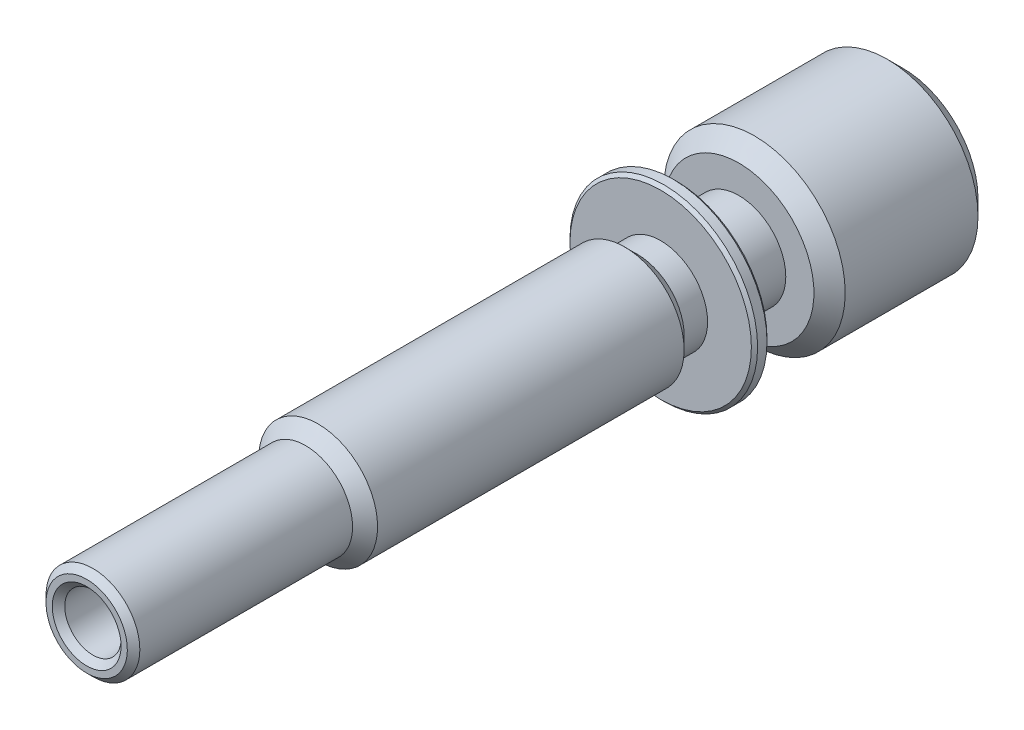
ISO-10303-21;
HEADER;
FILE_DESCRIPTION(('STEP AP214'),'2;1');
FILE_NAME('part.step','',(''),(''),'','','');
FILE_SCHEMA(('AUTOMOTIVE_DESIGN { 1 0 10303 214 1 1 1 1 }'));
ENDSEC;
DATA;
#1=APPLICATION_CONTEXT('core data for automotive mechanical design processes');
#2=APPLICATION_PROTOCOL_DEFINITION('international standard','automotive_design',2000,#1);
#3=PRODUCT_CONTEXT('',#1,'mechanical');
#4=PRODUCT('Part','Part','',(#3));
#5=PRODUCT_RELATED_PRODUCT_CATEGORY('part','',(#4));
#6=PRODUCT_DEFINITION_FORMATION('','',#4);
#7=PRODUCT_DEFINITION_CONTEXT('part definition',#1,'design');
#8=PRODUCT_DEFINITION('design','',#6,#7);
#9=PRODUCT_DEFINITION_SHAPE('','',#8);
#10=(LENGTH_UNIT() NAMED_UNIT(*) SI_UNIT(.MILLI.,.METRE.));
#11=(NAMED_UNIT(*) PLANE_ANGLE_UNIT() SI_UNIT($,.RADIAN.));
#12=(NAMED_UNIT(*) SI_UNIT($,.STERADIAN.) SOLID_ANGLE_UNIT());
#13=UNCERTAINTY_MEASURE_WITH_UNIT(LENGTH_MEASURE(1.E-05),#10,'distance_accuracy_value','');
#14=(GEOMETRIC_REPRESENTATION_CONTEXT(3) GLOBAL_UNCERTAINTY_ASSIGNED_CONTEXT((#13)) GLOBAL_UNIT_ASSIGNED_CONTEXT((#10,
#11,#12)) REPRESENTATION_CONTEXT('',''));
#15=CARTESIAN_POINT('',(0.,0.,0.));
#16=DIRECTION('',(0.,0.,1.));
#17=DIRECTION('',(1.,0.,0.));
#18=AXIS2_PLACEMENT_3D('',#15,#16,#17);
#19=CARTESIAN_POINT('',(0.,-50.0000007450581,7.5));
#20=DIRECTION('',(0.,0.,1.));
#21=DIRECTION('',(1.,0.,0.));
#22=AXIS2_PLACEMENT_3D('',#19,#20,#21);
#23=CYLINDRICAL_SURFACE('',#22,3.);
#24=CARTESIAN_POINT('',(0.,-50.0000007450581,7.34999999997399));
#25=DIRECTION('',(0.,0.,1.));
#26=DIRECTION('',(-1.,0.,0.));
#27=AXIS2_PLACEMENT_3D('',#24,#25,#26);
#28=CIRCLE('',#27,2.9999999999859);
#29=CARTESIAN_POINT('',(-2.9999999999859,-50.0000007450581,7.34999999997399));
#30=VERTEX_POINT('',#29);
#31=EDGE_CURVE('E63',#30,#30,#28,.F.);
#32=ORIENTED_EDGE('',*,*,#31,.F.);
#33=EDGE_LOOP('',(#32));
#34=FACE_BOUND('',#33,.T.);
#35=CARTESIAN_POINT('',(0.,-50.0000007450581,7.65000000001237));
#36=DIRECTION('',(0.,0.,-1.));
#37=DIRECTION('',(-1.,0.,0.));
#38=AXIS2_PLACEMENT_3D('',#35,#36,#37);
#39=CIRCLE('',#38,3.00000000004275);
#40=CARTESIAN_POINT('',(-3.00000000004275,-50.0000007450581,7.65000000001237));
#41=VERTEX_POINT('',#40);
#42=EDGE_CURVE('E66',#41,#41,#39,.F.);
#43=ORIENTED_EDGE('',*,*,#42,.F.);
#44=EDGE_LOOP('',(#43));
#45=FACE_BOUND('',#44,.T.);
#46=ADVANCED_FACE('F15',(#34,#45),#23,.T.);
#47=CARTESIAN_POINT('',(0.,-50.0000007450581,7.65000000012606));
#48=DIRECTION('',(0.,0.,-1.));
#49=DIRECTION('',(-1.,0.,0.));
#50=AXIS2_PLACEMENT_3D('',#47,#48,#49);
#51=CONICAL_SURFACE('',#50,2.99999999992906,0.785398163113231);
#52=ORIENTED_EDGE('',*,*,#42,.T.);
#53=EDGE_LOOP('',(#52));
#54=FACE_BOUND('',#53,.T.);
#55=CARTESIAN_POINT('',(0.,-50.0000007450581,7.75000000004411));
#56=DIRECTION('',(0.,0.,-1.));
#57=DIRECTION('',(-1.,0.,0.));
#58=AXIS2_PLACEMENT_3D('',#55,#56,#57);
#59=CIRCLE('',#58,2.90000000006785);
#60=CARTESIAN_POINT('',(-2.90000000006785,-50.0000007450581,7.75000000004411));
#61=VERTEX_POINT('',#60);
#62=EDGE_CURVE('E18',#61,#61,#59,.F.);
#63=ORIENTED_EDGE('',*,*,#62,.F.);
#64=EDGE_LOOP('',(#63));
#65=FACE_BOUND('',#64,.T.);
#66=ADVANCED_FACE('F96',(#54,#65),#51,.T.);
#67=CARTESIAN_POINT('',(0.,-50.0000007450581,7.34999999997399));
#68=DIRECTION('',(0.,0.,1.));
#69=DIRECTION('',(1.,0.,0.));
#70=AXIS2_PLACEMENT_3D('',#67,#68,#69);
#71=CONICAL_SURFACE('',#70,2.9999999999859,0.785398163113231);
#72=ORIENTED_EDGE('',*,*,#31,.T.);
#73=EDGE_LOOP('',(#72));
#74=FACE_BOUND('',#73,.T.);
#75=CARTESIAN_POINT('',(0.,-50.0000007450581,7.24999999994225));
#76=DIRECTION('',(0.,0.,1.));
#77=DIRECTION('',(1.,0.,0.));
#78=AXIS2_PLACEMENT_3D('',#75,#76,#77);
#79=CIRCLE('',#78,2.900000000011);
#80=CARTESIAN_POINT('',(2.900000000011,-50.0000007450581,7.24999999994225));
#81=VERTEX_POINT('',#80);
#82=EDGE_CURVE('E87',#81,#81,#79,.F.);
#83=ORIENTED_EDGE('',*,*,#82,.F.);
#84=EDGE_LOOP('',(#83));
#85=FACE_BOUND('',#84,.T.);
#86=ADVANCED_FACE('F98',(#74,#85),#71,.T.);
#87=CARTESIAN_POINT('',(0.,-50.0000007450581,7.75));
#88=DIRECTION('',(0.,0.,1.));
#89=DIRECTION('',(1.,0.,0.));
#90=AXIS2_PLACEMENT_3D('',#87,#88,#89);
#91=PLANE('',#90);
#92=CARTESIAN_POINT('',(0.,-50.0000007450581,7.75));
#93=DIRECTION('',(0.,0.,1.));
#94=DIRECTION('',(1.,0.,0.));
#95=AXIS2_PLACEMENT_3D('',#92,#93,#94);
#96=CIRCLE('',#95,1.5);
#97=CARTESIAN_POINT('',(1.5,-50.0000007450581,7.75));
#98=VERTEX_POINT('',#97);
#99=EDGE_CURVE('E85',#98,#98,#96,.T.);
#100=ORIENTED_EDGE('',*,*,#99,.F.);
#101=EDGE_LOOP('',(#100));
#102=FACE_BOUND('',#101,.T.);
#103=ORIENTED_EDGE('',*,*,#62,.T.);
#104=EDGE_LOOP('',(#103));
#105=FACE_BOUND('',#104,.T.);
#106=ADVANCED_FACE('F94',(#102,#105),#91,.T.);
#107=CARTESIAN_POINT('',(0.,-50.0000007450581,7.25));
#108=DIRECTION('',(0.,0.,-1.));
#109=DIRECTION('',(-1.,0.,0.));
#110=AXIS2_PLACEMENT_3D('',#107,#108,#109);
#111=PLANE('',#110);
#112=CARTESIAN_POINT('',(0.,-50.0000007450581,7.25));
#113=DIRECTION('',(0.,0.,1.));
#114=DIRECTION('',(1.,0.,0.));
#115=AXIS2_PLACEMENT_3D('',#112,#113,#114);
#116=CIRCLE('',#115,1.5);
#117=CARTESIAN_POINT('',(1.5,-50.0000007450581,7.25));
#118=VERTEX_POINT('',#117);
#119=EDGE_CURVE('E62',#118,#118,#116,.F.);
#120=ORIENTED_EDGE('',*,*,#119,.F.);
#121=EDGE_LOOP('',(#120));
#122=FACE_BOUND('',#121,.T.);
#123=ORIENTED_EDGE('',*,*,#82,.T.);
#124=EDGE_LOOP('',(#123));
#125=FACE_BOUND('',#124,.T.);
#126=ADVANCED_FACE('F175',(#122,#125),#111,.T.);
#127=CARTESIAN_POINT('',(0.,-50.0000007450581,8.125));
#128=DIRECTION('',(0.,0.,1.));
#129=DIRECTION('',(1.,0.,0.));
#130=AXIS2_PLACEMENT_3D('',#127,#128,#129);
#131=CYLINDRICAL_SURFACE('',#130,1.5);
#132=ORIENTED_EDGE('',*,*,#99,.T.);
#133=EDGE_LOOP('',(#132));
#134=FACE_BOUND('',#133,.T.);
#135=CARTESIAN_POINT('',(0.,-50.0000007450581,8.49999999996953));
#136=DIRECTION('',(0.,0.,1.));
#137=DIRECTION('',(-1.,0.,0.));
#138=AXIS2_PLACEMENT_3D('',#135,#136,#137);
#139=CIRCLE('',#138,1.50000000007822);
#140=CARTESIAN_POINT('',(-1.50000000007822,-50.0000007450581,8.49999999996953));
#141=VERTEX_POINT('',#140);
#142=EDGE_CURVE('E59',#141,#141,#139,.T.);
#143=ORIENTED_EDGE('',*,*,#142,.F.);
#144=EDGE_LOOP('',(#143));
#145=FACE_BOUND('',#144,.T.);
#146=ADVANCED_FACE('F171',(#134,#145),#131,.T.);
#147=CARTESIAN_POINT('',(0.,-50.0000007450581,6.25));
#148=DIRECTION('',(0.,0.,1.));
#149=DIRECTION('',(1.,0.,0.));
#150=AXIS2_PLACEMENT_3D('',#147,#148,#149);
#151=CYLINDRICAL_SURFACE('',#150,1.5);
#152=CARTESIAN_POINT('',(0.,-50.0000007450581,5.25));
#153=DIRECTION('',(0.,0.,1.));
#154=DIRECTION('',(1.,0.,0.));
#155=AXIS2_PLACEMENT_3D('',#152,#153,#154);
#156=CIRCLE('',#155,1.5);
#157=CARTESIAN_POINT('',(1.5,-50.0000007450581,5.25));
#158=VERTEX_POINT('',#157);
#159=EDGE_CURVE('E54',#158,#158,#156,.F.);
#160=ORIENTED_EDGE('',*,*,#159,.F.);
#161=EDGE_LOOP('',(#160));
#162=FACE_BOUND('',#161,.T.);
#163=ORIENTED_EDGE('',*,*,#119,.T.);
#164=EDGE_LOOP('',(#163));
#165=FACE_BOUND('',#164,.T.);
#166=ADVANCED_FACE('F167',(#162,#165),#151,.T.);
#167=CARTESIAN_POINT('',(0.,-50.0000007450581,8.89999999986912));
#168=DIRECTION('',(0.,0.,1.));
#169=DIRECTION('',(1.,0.,0.));
#170=AXIS2_PLACEMENT_3D('',#167,#168,#169);
#171=CONICAL_SURFACE('',#170,1.89999999997781,0.785398163468503);
#172=CARTESIAN_POINT('',(0.,-50.0000007450581,8.9));
#173=DIRECTION('',(0.,0.,1.));
#174=DIRECTION('',(1.,0.,0.));
#175=AXIS2_PLACEMENT_3D('',#172,#173,#174);
#176=CIRCLE('',#175,1.9);
#177=CARTESIAN_POINT('',(1.9,-50.0000007450581,8.9));
#178=VERTEX_POINT('',#177);
#179=EDGE_CURVE('E50',#178,#178,#176,.T.);
#180=ORIENTED_EDGE('',*,*,#179,.F.);
#181=EDGE_LOOP('',(#180));
#182=FACE_BOUND('',#181,.T.);
#183=ORIENTED_EDGE('',*,*,#142,.T.);
#184=EDGE_LOOP('',(#183));
#185=FACE_BOUND('',#184,.T.);
#186=ADVANCED_FACE('F163',(#182,#185),#171,.T.);
#187=CARTESIAN_POINT('',(0.,-50.0000007450581,5.25));
#188=DIRECTION('',(0.,0.,1.));
#189=DIRECTION('',(1.,0.,0.));
#190=AXIS2_PLACEMENT_3D('',#187,#188,#189);
#191=PLANE('',#190);
#192=ORIENTED_EDGE('',*,*,#159,.T.);
#193=EDGE_LOOP('',(#192));
#194=FACE_BOUND('',#193,.T.);
#195=CARTESIAN_POINT('',(0.,-50.0000007450581,5.24999999998954));
#196=DIRECTION('',(0.,0.,-1.));
#197=DIRECTION('',(-1.,0.,0.));
#198=AXIS2_PLACEMENT_3D('',#195,#196,#197);
#199=CIRCLE('',#198,2.39999999996598);
#200=CARTESIAN_POINT('',(-2.39999999996598,-50.0000007450581,5.24999999998954));
#201=VERTEX_POINT('',#200);
#202=EDGE_CURVE('E53',#201,#201,#199,.T.);
#203=ORIENTED_EDGE('',*,*,#202,.F.);
#204=EDGE_LOOP('',(#203));
#205=FACE_BOUND('',#204,.T.);
#206=ADVANCED_FACE('F159',(#194,#205),#191,.T.);
#207=CARTESIAN_POINT('',(0.,-50.0000007450581,13.8));
#208=DIRECTION('',(0.,0.,1.));
#209=DIRECTION('',(1.,0.,0.));
#210=AXIS2_PLACEMENT_3D('',#207,#208,#209);
#211=CYLINDRICAL_SURFACE('',#210,1.9);
#212=ORIENTED_EDGE('',*,*,#179,.T.);
#213=EDGE_LOOP('',(#212));
#214=FACE_BOUND('',#213,.T.);
#215=CARTESIAN_POINT('',(0.,-50.0000007450581,18.7000000000239));
#216=DIRECTION('',(0.,0.,-1.));
#217=DIRECTION('',(-1.,0.,0.));
#218=AXIS2_PLACEMENT_3D('',#215,#216,#217);
#219=CIRCLE('',#218,1.89999999992096);
#220=CARTESIAN_POINT('',(-1.89999999992096,-50.0000007450581,18.7000000000239));
#221=VERTEX_POINT('',#220);
#222=EDGE_CURVE('E45',#221,#221,#219,.F.);
#223=ORIENTED_EDGE('',*,*,#222,.F.);
#224=EDGE_LOOP('',(#223));
#225=FACE_BOUND('',#224,.T.);
#226=ADVANCED_FACE('F155',(#214,#225),#211,.T.);
#227=CARTESIAN_POINT('',(0.,-50.0000007450581,4.75000000000136));
#228=DIRECTION('',(0.,0.,-1.));
#229=DIRECTION('',(-1.,0.,0.));
#230=AXIS2_PLACEMENT_3D('',#227,#228,#229);
#231=CONICAL_SURFACE('',#230,2.89999999995416,0.785398163397448);
#232=CARTESIAN_POINT('',(0.,-50.0000007450581,4.75));
#233=DIRECTION('',(0.,0.,1.));
#234=DIRECTION('',(1.,0.,0.));
#235=AXIS2_PLACEMENT_3D('',#232,#233,#234);
#236=CIRCLE('',#235,2.9);
#237=CARTESIAN_POINT('',(2.9,-50.0000007450581,4.75));
#238=VERTEX_POINT('',#237);
#239=EDGE_CURVE('E36',#238,#238,#236,.F.);
#240=ORIENTED_EDGE('',*,*,#239,.F.);
#241=EDGE_LOOP('',(#240));
#242=FACE_BOUND('',#241,.T.);
#243=ORIENTED_EDGE('',*,*,#202,.T.);
#244=EDGE_LOOP('',(#243));
#245=FACE_BOUND('',#244,.T.);
#246=ADVANCED_FACE('F151',(#242,#245),#231,.T.);
#247=CARTESIAN_POINT('',(0.,-50.0000007450581,18.7000000000808));
#248=DIRECTION('',(0.,0.,-1.));
#249=DIRECTION('',(-1.,0.,0.));
#250=AXIS2_PLACEMENT_3D('',#247,#248,#249);
#251=CONICAL_SURFACE('',#250,1.89999999986412,0.785398163397448);
#252=ORIENTED_EDGE('',*,*,#222,.T.);
#253=EDGE_LOOP('',(#252));
#254=FACE_BOUND('',#253,.T.);
#255=CARTESIAN_POINT('',(0.,-50.0000007450581,19.1));
#256=DIRECTION('',(0.,0.,1.));
#257=DIRECTION('',(1.,0.,0.));
#258=AXIS2_PLACEMENT_3D('',#255,#256,#257);
#259=CIRCLE('',#258,1.5);
#260=CARTESIAN_POINT('',(1.5,-50.0000007450581,19.1));
#261=VERTEX_POINT('',#260);
#262=EDGE_CURVE('E32',#261,#261,#259,.T.);
#263=ORIENTED_EDGE('',*,*,#262,.F.);
#264=EDGE_LOOP('',(#263));
#265=FACE_BOUND('',#264,.T.);
#266=ADVANCED_FACE('F147',(#254,#265),#251,.T.);
#267=CARTESIAN_POINT('',(0.,-50.0000007450581,2.625));
#268=DIRECTION('',(0.,0.,1.));
#269=DIRECTION('',(1.,0.,0.));
#270=AXIS2_PLACEMENT_3D('',#267,#268,#269);
#271=CYLINDRICAL_SURFACE('',#270,2.9);
#272=CARTESIAN_POINT('',(0.,-50.0000007450581,0.504999999975553));
#273=DIRECTION('',(0.,0.,1.));
#274=DIRECTION('',(1.,0.,0.));
#275=AXIS2_PLACEMENT_3D('',#272,#273,#274);
#276=CIRCLE('',#275,2.89999999995416);
#277=CARTESIAN_POINT('',(2.89999999995416,-50.0000007450581,0.504999999975553));
#278=VERTEX_POINT('',#277);
#279=EDGE_CURVE('E35',#278,#278,#276,.F.);
#280=ORIENTED_EDGE('',*,*,#279,.F.);
#281=EDGE_LOOP('',(#280));
#282=FACE_BOUND('',#281,.T.);
#283=ORIENTED_EDGE('',*,*,#239,.T.);
#284=EDGE_LOOP('',(#283));
#285=FACE_BOUND('',#284,.T.);
#286=ADVANCED_FACE('F143',(#282,#285),#271,.T.);
#287=CARTESIAN_POINT('',(0.,-50.0000007450581,22.6));
#288=DIRECTION('',(0.,0.,1.));
#289=DIRECTION('',(1.,0.,0.));
#290=AXIS2_PLACEMENT_3D('',#287,#288,#289);
#291=CYLINDRICAL_SURFACE('',#290,1.5);
#292=ORIENTED_EDGE('',*,*,#262,.T.);
#293=EDGE_LOOP('',(#292));
#294=FACE_BOUND('',#293,.T.);
#295=CARTESIAN_POINT('',(0.,-50.0000007450581,25.8999999999787));
#296=DIRECTION('',(0.,0.,-1.));
#297=DIRECTION('',(-1.,0.,0.));
#298=AXIS2_PLACEMENT_3D('',#295,#296,#297);
#299=CIRCLE('',#298,1.50000000002137);
#300=CARTESIAN_POINT('',(-1.50000000002137,-50.0000007450581,25.8999999999787));
#301=VERTEX_POINT('',#300);
#302=EDGE_CURVE('E39',#301,#301,#299,.F.);
#303=ORIENTED_EDGE('',*,*,#302,.F.);
#304=EDGE_LOOP('',(#303));
#305=FACE_BOUND('',#304,.T.);
#306=ADVANCED_FACE('F139',(#294,#305),#291,.T.);
#307=CARTESIAN_POINT('',(0.,-50.0000007450581,0.504999999975553));
#308=DIRECTION('',(0.,0.,1.));
#309=DIRECTION('',(1.,0.,0.));
#310=AXIS2_PLACEMENT_3D('',#307,#308,#309);
#311=CONICAL_SURFACE('',#310,2.89999999995416,0.785398163397448);
#312=CARTESIAN_POINT('',(0.,-50.0000007450581,0.00499999998737621));
#313=DIRECTION('',(0.,0.,1.));
#314=DIRECTION('',(1.,0.,0.));
#315=AXIS2_PLACEMENT_3D('',#312,#313,#314);
#316=CIRCLE('',#315,2.39999999996598);
#317=CARTESIAN_POINT('',(2.39999999996598,-50.0000007450581,0.00499999998737621));
#318=VERTEX_POINT('',#317);
#319=EDGE_CURVE('E42',#318,#318,#316,.F.);
#320=ORIENTED_EDGE('',*,*,#319,.F.);
#321=EDGE_LOOP('',(#320));
#322=FACE_BOUND('',#321,.T.);
#323=ORIENTED_EDGE('',*,*,#279,.T.);
#324=EDGE_LOOP('',(#323));
#325=FACE_BOUND('',#324,.T.);
#326=ADVANCED_FACE('F135',(#322,#325),#311,.T.);
#327=CARTESIAN_POINT('',(0.,-50.0000007450581,25.8999999999787));
#328=DIRECTION('',(0.,0.,-1.));
#329=DIRECTION('',(0.,1.,0.));
#330=AXIS2_PLACEMENT_3D('',#327,#328,#329);
#331=CONICAL_SURFACE('',#330,1.50000000002137,0.78539816325534);
#332=ORIENTED_EDGE('',*,*,#302,.T.);
#333=EDGE_LOOP('',(#332));
#334=FACE_BOUND('',#333,.T.);
#335=CARTESIAN_POINT('',(0.,-50.0000007450581,26.1000000000422));
#336=DIRECTION('',(0.,0.,-1.));
#337=DIRECTION('',(0.,1.,0.));
#338=AXIS2_PLACEMENT_3D('',#335,#336,#337);
#339=CIRCLE('',#338,1.30000000001473);
#340=CARTESIAN_POINT('',(0.,-48.7000007450434,26.1000000000422));
#341=VERTEX_POINT('',#340);
#342=EDGE_CURVE('E74',#341,#341,#339,.F.);
#343=ORIENTED_EDGE('',*,*,#342,.F.);
#344=EDGE_LOOP('',(#343));
#345=FACE_BOUND('',#344,.T.);
#346=ADVANCED_FACE('F131',(#334,#345),#331,.T.);
#347=CARTESIAN_POINT('',(0.,-50.0000007450581,0.00499999999999945));
#348=DIRECTION('',(0.,0.,-1.));
#349=DIRECTION('',(-1.,0.,0.));
#350=AXIS2_PLACEMENT_3D('',#347,#348,#349);
#351=PLANE('',#350);
#352=CARTESIAN_POINT('',(0.,-50.0000007450581,0.00499999998741785));
#353=DIRECTION('',(0.,0.,-1.));
#354=DIRECTION('',(-1.,0.,0.));
#355=AXIS2_PLACEMENT_3D('',#352,#353,#354);
#356=CIRCLE('',#355,0.99999999991951);
#357=CARTESIAN_POINT('',(-0.99999999991951,-50.0000007450581,0.00499999998741785));
#358=VERTEX_POINT('',#357);
#359=EDGE_CURVE('E71',#358,#358,#356,.F.);
#360=ORIENTED_EDGE('',*,*,#359,.T.);
#361=EDGE_LOOP('',(#360));
#362=FACE_BOUND('',#361,.T.);
#363=ORIENTED_EDGE('',*,*,#319,.T.);
#364=EDGE_LOOP('',(#363));
#365=FACE_BOUND('',#364,.T.);
#366=ADVANCED_FACE('F127',(#362,#365),#351,.T.);
#367=CARTESIAN_POINT('',(0.,-50.0000007450581,26.1));
#368=DIRECTION('',(0.,0.,1.));
#369=DIRECTION('',(1.,0.,0.));
#370=AXIS2_PLACEMENT_3D('',#367,#368,#369);
#371=PLANE('',#370);
#372=CARTESIAN_POINT('',(0.,-50.0000007450581,26.1000000000422));
#373=DIRECTION('',(0.,0.,1.));
#374=DIRECTION('',(1.,0.,0.));
#375=AXIS2_PLACEMENT_3D('',#372,#373,#374);
#376=CIRCLE('',#375,1.10000000006494);
#377=CARTESIAN_POINT('',(1.10000000006494,-50.0000007450581,26.1000000000422));
#378=VERTEX_POINT('',#377);
#379=EDGE_CURVE('E27',#378,#378,#376,.F.);
#380=ORIENTED_EDGE('',*,*,#379,.T.);
#381=EDGE_LOOP('',(#380));
#382=FACE_BOUND('',#381,.T.);
#383=ORIENTED_EDGE('',*,*,#342,.T.);
#384=EDGE_LOOP('',(#383));
#385=FACE_BOUND('',#384,.T.);
#386=ADVANCED_FACE('F123',(#382,#385),#371,.T.);
#387=CARTESIAN_POINT('',(0.,-50.0000007450581,0.00499999998737621));
#388=DIRECTION('',(0.,0.,-1.));
#389=DIRECTION('',(-1.,0.,0.));
#390=AXIS2_PLACEMENT_3D('',#387,#388,#389);
#391=CONICAL_SURFACE('',#390,0.999999999919551,0.785398163397448);
#392=CARTESIAN_POINT('',(0.,-50.0000007450581,0.104999999999999));
#393=DIRECTION('',(0.,0.,-1.));
#394=DIRECTION('',(-1.,0.,0.));
#395=AXIS2_PLACEMENT_3D('',#392,#393,#394);
#396=CIRCLE('',#395,0.899999999999999);
#397=CARTESIAN_POINT('',(-0.899999999999999,-50.0000007450581,0.104999999999999));
#398=VERTEX_POINT('',#397);
#399=EDGE_CURVE('E22',#398,#398,#396,.F.);
#400=ORIENTED_EDGE('',*,*,#399,.T.);
#401=EDGE_LOOP('',(#400));
#402=FACE_BOUND('',#401,.T.);
#403=ORIENTED_EDGE('',*,*,#359,.F.);
#404=EDGE_LOOP('',(#403));
#405=FACE_BOUND('',#404,.T.);
#406=ADVANCED_FACE('F116',(#402,#405),#391,.F.);
#407=CARTESIAN_POINT('',(0.,-50.0000007450581,26.0999999998717));
#408=DIRECTION('',(0.,0.,1.));
#409=DIRECTION('',(1.,0.,0.));
#410=AXIS2_PLACEMENT_3D('',#407,#408,#409);
#411=CONICAL_SURFACE('',#410,1.09999999989437,0.785398163539557);
#412=CARTESIAN_POINT('',(0.,-50.0000007450581,25.9));
#413=DIRECTION('',(0.,0.,-1.));
#414=DIRECTION('',(-1.,0.,0.));
#415=AXIS2_PLACEMENT_3D('',#412,#413,#414);
#416=CIRCLE('',#415,0.899999999999999);
#417=CARTESIAN_POINT('',(-0.899999999999999,-50.0000007450581,25.9));
#418=VERTEX_POINT('',#417);
#419=EDGE_CURVE('E10',#418,#418,#416,.T.);
#420=ORIENTED_EDGE('',*,*,#419,.T.);
#421=EDGE_LOOP('',(#420));
#422=FACE_BOUND('',#421,.T.);
#423=ORIENTED_EDGE('',*,*,#379,.F.);
#424=EDGE_LOOP('',(#423));
#425=FACE_BOUND('',#424,.T.);
#426=ADVANCED_FACE('F110',(#422,#425),#411,.F.);
#427=CARTESIAN_POINT('',(0.,-50.0000007450581,10.1));
#428=DIRECTION('',(0.,0.,-1.));
#429=DIRECTION('',(-1.,0.,0.));
#430=AXIS2_PLACEMENT_3D('',#427,#428,#429);
#431=CYLINDRICAL_SURFACE('',#430,0.899999999999999);
#432=ORIENTED_EDGE('',*,*,#399,.F.);
#433=EDGE_LOOP('',(#432));
#434=FACE_BOUND('',#433,.T.);
#435=ORIENTED_EDGE('',*,*,#419,.F.);
#436=EDGE_LOOP('',(#435));
#437=FACE_BOUND('',#436,.T.);
#438=ADVANCED_FACE('F108',(#434,#437),#431,.F.);
#439=CLOSED_SHELL('',(#46,#66,#86,#106,#126,#146,#166,#186,#206,#226,#246,#266,#286,#306,#326,
#346,#366,#386,#406,#426,#438));
#440=MANIFOLD_SOLID_BREP('B1',#439);
#441=ADVANCED_BREP_SHAPE_REPRESENTATION('',(#18,#440),#14);
#442=SHAPE_DEFINITION_REPRESENTATION(#9,#441);
ENDSEC;
END-ISO-10303-21;
